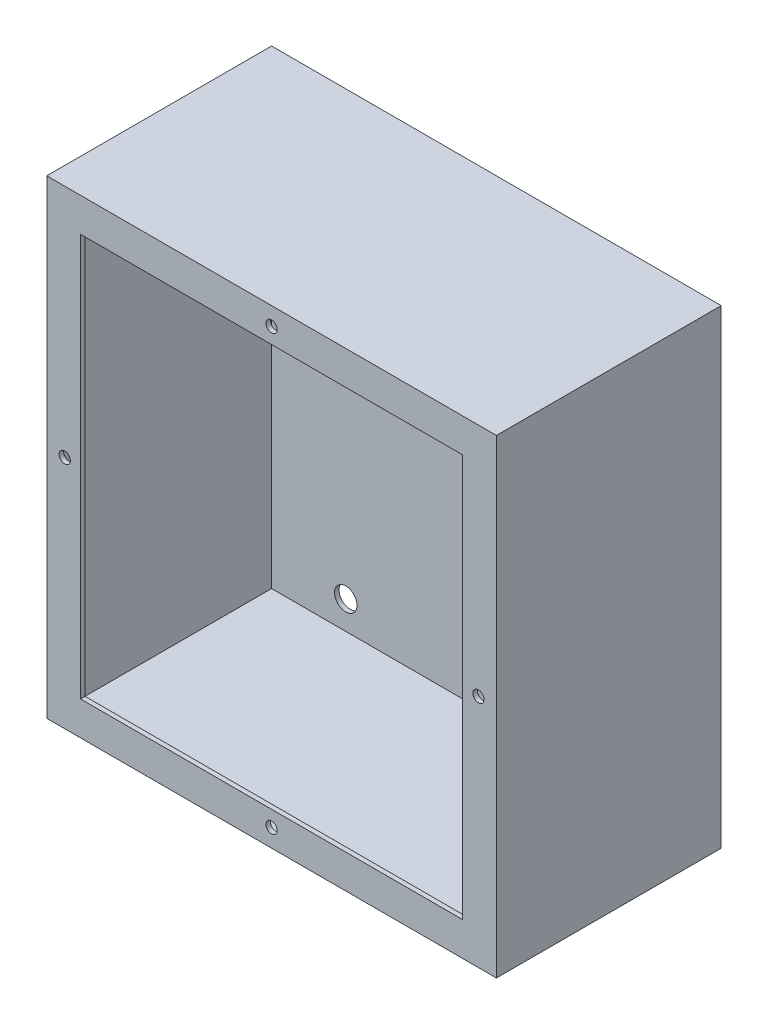
ISO-10303-21;
HEADER;
FILE_DESCRIPTION(('STEP AP214'),'2;1');
FILE_NAME('part.step','',(''),(''),'','','');
FILE_SCHEMA(('AUTOMOTIVE_DESIGN { 1 0 10303 214 1 1 1 1 }'));
ENDSEC;
DATA;
#1=APPLICATION_CONTEXT('core data for automotive mechanical design processes');
#2=APPLICATION_PROTOCOL_DEFINITION('international standard','automotive_design',2000,#1);
#3=PRODUCT_CONTEXT('',#1,'mechanical');
#4=PRODUCT('Part','Part','',(#3));
#5=PRODUCT_RELATED_PRODUCT_CATEGORY('part','',(#4));
#6=PRODUCT_DEFINITION_FORMATION('','',#4);
#7=PRODUCT_DEFINITION_CONTEXT('part definition',#1,'design');
#8=PRODUCT_DEFINITION('design','',#6,#7);
#9=PRODUCT_DEFINITION_SHAPE('','',#8);
#10=(LENGTH_UNIT() NAMED_UNIT(*) SI_UNIT(.MILLI.,.METRE.));
#11=(NAMED_UNIT(*) PLANE_ANGLE_UNIT() SI_UNIT($,.RADIAN.));
#12=(NAMED_UNIT(*) SI_UNIT($,.STERADIAN.) SOLID_ANGLE_UNIT());
#13=UNCERTAINTY_MEASURE_WITH_UNIT(LENGTH_MEASURE(1.E-05),#10,'distance_accuracy_value','');
#14=(GEOMETRIC_REPRESENTATION_CONTEXT(3) GLOBAL_UNCERTAINTY_ASSIGNED_CONTEXT((#13)) GLOBAL_UNIT_ASSIGNED_CONTEXT((#10,
#11,#12)) REPRESENTATION_CONTEXT('',''));
#15=CARTESIAN_POINT('',(0.,0.,0.));
#16=DIRECTION('',(0.,0.,1.));
#17=DIRECTION('',(1.,0.,0.));
#18=AXIS2_PLACEMENT_3D('',#15,#16,#17);
#19=CARTESIAN_POINT('',(0.,0.,100.));
#20=DIRECTION('',(1.,0.,0.));
#21=DIRECTION('',(0.,1.,0.));
#22=AXIS2_PLACEMENT_3D('',#19,#20,#21);
#23=PLANE('',#22);
#24=DIRECTION('',(0.,-1.,0.));
#25=VECTOR('',#24,1.);
#26=CARTESIAN_POINT('',(0.,0.,0.));
#27=LINE('',#26,#25);
#28=CARTESIAN_POINT('',(0.,0.,0.));
#29=VERTEX_POINT('',#28);
#30=CARTESIAN_POINT('',(0.,-209.,0.));
#31=VERTEX_POINT('',#30);
#32=EDGE_CURVE('E190',#29,#31,#27,.T.);
#33=ORIENTED_EDGE('',*,*,#32,.T.);
#34=DIRECTION('',(0.,0.,-1.));
#35=VECTOR('',#34,1.);
#36=CARTESIAN_POINT('',(0.,-209.,100.));
#37=LINE('',#36,#35);
#38=CARTESIAN_POINT('',(0.,-209.,100.));
#39=VERTEX_POINT('',#38);
#40=EDGE_CURVE('E11',#39,#31,#37,.T.);
#41=ORIENTED_EDGE('',*,*,#40,.F.);
#42=DIRECTION('',(0.,-1.,0.));
#43=VECTOR('',#42,1.);
#44=CARTESIAN_POINT('',(0.,0.,100.));
#45=LINE('',#44,#43);
#46=CARTESIAN_POINT('',(0.,0.,100.));
#47=VERTEX_POINT('',#46);
#48=EDGE_CURVE('E205',#47,#39,#45,.T.);
#49=ORIENTED_EDGE('',*,*,#48,.F.);
#50=DIRECTION('',(0.,0.,-1.));
#51=VECTOR('',#50,1.);
#52=CARTESIAN_POINT('',(0.,0.,100.));
#53=LINE('',#52,#51);
#54=EDGE_CURVE('E211',#47,#29,#53,.T.);
#55=ORIENTED_EDGE('',*,*,#54,.T.);
#56=EDGE_LOOP('',(#33,#41,#49,#55));
#57=FACE_BOUND('',#56,.T.);
#58=ADVANCED_FACE('F30',(#57),#23,.F.);
#59=CARTESIAN_POINT('',(0.,-209.,100.));
#60=DIRECTION('',(0.,1.,0.));
#61=DIRECTION('',(0.,0.,1.));
#62=AXIS2_PLACEMENT_3D('',#59,#60,#61);
#63=PLANE('',#62);
#64=DIRECTION('',(1.,0.,0.));
#65=VECTOR('',#64,1.);
#66=CARTESIAN_POINT('',(0.,-209.,0.));
#67=LINE('',#66,#65);
#68=CARTESIAN_POINT('',(200.,-209.,0.));
#69=VERTEX_POINT('',#68);
#70=EDGE_CURVE('E214',#31,#69,#67,.T.);
#71=ORIENTED_EDGE('',*,*,#70,.T.);
#72=DIRECTION('',(0.,0.,-1.));
#73=VECTOR('',#72,1.);
#74=CARTESIAN_POINT('',(200.,-209.,100.));
#75=LINE('',#74,#73);
#76=CARTESIAN_POINT('',(200.,-209.,100.));
#77=VERTEX_POINT('',#76);
#78=EDGE_CURVE('E38',#77,#69,#75,.T.);
#79=ORIENTED_EDGE('',*,*,#78,.F.);
#80=DIRECTION('',(1.,0.,0.));
#81=VECTOR('',#80,1.);
#82=CARTESIAN_POINT('',(0.,-209.,100.));
#83=LINE('',#82,#81);
#84=EDGE_CURVE('E83',#39,#77,#83,.T.);
#85=ORIENTED_EDGE('',*,*,#84,.F.);
#86=ORIENTED_EDGE('',*,*,#40,.T.);
#87=EDGE_LOOP('',(#71,#79,#85,#86));
#88=FACE_BOUND('',#87,.T.);
#89=ADVANCED_FACE('F289',(#88),#63,.F.);
#90=CARTESIAN_POINT('',(200.,0.,100.));
#91=DIRECTION('',(-1.,0.,0.));
#92=DIRECTION('',(0.,-1.,0.));
#93=AXIS2_PLACEMENT_3D('',#90,#91,#92);
#94=PLANE('',#93);
#95=DIRECTION('',(0.,1.,0.));
#96=VECTOR('',#95,1.);
#97=CARTESIAN_POINT('',(200.,0.,0.));
#98=LINE('',#97,#96);
#99=CARTESIAN_POINT('',(200.,0.,0.));
#100=VERTEX_POINT('',#99);
#101=EDGE_CURVE('E216',#69,#100,#98,.T.);
#102=ORIENTED_EDGE('',*,*,#101,.T.);
#103=DIRECTION('',(0.,0.,-1.));
#104=VECTOR('',#103,1.);
#105=CARTESIAN_POINT('',(200.,0.,100.));
#106=LINE('',#105,#104);
#107=CARTESIAN_POINT('',(200.,0.,100.));
#108=VERTEX_POINT('',#107);
#109=EDGE_CURVE('E220',#108,#100,#106,.T.);
#110=ORIENTED_EDGE('',*,*,#109,.F.);
#111=DIRECTION('',(0.,1.,0.));
#112=VECTOR('',#111,1.);
#113=CARTESIAN_POINT('',(200.,0.,100.));
#114=LINE('',#113,#112);
#115=EDGE_CURVE('E208',#77,#108,#114,.T.);
#116=ORIENTED_EDGE('',*,*,#115,.F.);
#117=ORIENTED_EDGE('',*,*,#78,.T.);
#118=EDGE_LOOP('',(#102,#110,#116,#117));
#119=FACE_BOUND('',#118,.T.);
#120=ADVANCED_FACE('F288',(#119),#94,.F.);
#121=CARTESIAN_POINT('',(0.,0.,100.));
#122=DIRECTION('',(0.,-1.,0.));
#123=DIRECTION('',(0.,0.,-1.));
#124=AXIS2_PLACEMENT_3D('',#121,#122,#123);
#125=PLANE('',#124);
#126=DIRECTION('',(-1.,0.,0.));
#127=VECTOR('',#126,1.);
#128=CARTESIAN_POINT('',(0.,0.,0.));
#129=LINE('',#128,#127);
#130=EDGE_CURVE('E76',#100,#29,#129,.T.);
#131=ORIENTED_EDGE('',*,*,#130,.T.);
#132=ORIENTED_EDGE('',*,*,#54,.F.);
#133=DIRECTION('',(-1.,0.,0.));
#134=VECTOR('',#133,1.);
#135=CARTESIAN_POINT('',(0.,0.,100.));
#136=LINE('',#135,#134);
#137=EDGE_CURVE('E55',#108,#47,#136,.T.);
#138=ORIENTED_EDGE('',*,*,#137,.F.);
#139=ORIENTED_EDGE('',*,*,#109,.T.);
#140=EDGE_LOOP('',(#131,#132,#138,#139));
#141=FACE_BOUND('',#140,.T.);
#142=ADVANCED_FACE('F284',(#141),#125,.F.);
#143=CARTESIAN_POINT('',(0.,-209.,100.));
#144=DIRECTION('',(0.,0.,1.));
#145=DIRECTION('',(1.,0.,0.));
#146=AXIS2_PLACEMENT_3D('',#143,#144,#145);
#147=PLANE('',#146);
#148=CARTESIAN_POINT('',(100.,-201.,100.));
#149=DIRECTION('',(0.,0.,1.));
#150=DIRECTION('',(1.,0.,0.));
#151=AXIS2_PLACEMENT_3D('',#148,#149,#150);
#152=CIRCLE('',#151,2.50000000000001);
#153=CARTESIAN_POINT('',(102.5,-201.,100.));
#154=VERTEX_POINT('',#153);
#155=EDGE_CURVE('E257',#154,#154,#152,.T.);
#156=ORIENTED_EDGE('',*,*,#155,.F.);
#157=EDGE_LOOP('',(#156));
#158=FACE_BOUND('',#157,.T.);
#159=CARTESIAN_POINT('',(8.,-104.5,100.));
#160=DIRECTION('',(0.,0.,1.));
#161=DIRECTION('',(1.,0.,0.));
#162=AXIS2_PLACEMENT_3D('',#159,#160,#161);
#163=CIRCLE('',#162,2.5);
#164=CARTESIAN_POINT('',(10.5,-104.5,100.));
#165=VERTEX_POINT('',#164);
#166=EDGE_CURVE('E247',#165,#165,#163,.T.);
#167=ORIENTED_EDGE('',*,*,#166,.F.);
#168=EDGE_LOOP('',(#167));
#169=FACE_BOUND('',#168,.T.);
#170=CARTESIAN_POINT('',(192.,-104.5,100.));
#171=DIRECTION('',(0.,0.,1.));
#172=DIRECTION('',(1.,0.,0.));
#173=AXIS2_PLACEMENT_3D('',#170,#171,#172);
#174=CIRCLE('',#173,2.5);
#175=CARTESIAN_POINT('',(194.5,-104.5,100.));
#176=VERTEX_POINT('',#175);
#177=EDGE_CURVE('E244',#176,#176,#174,.T.);
#178=ORIENTED_EDGE('',*,*,#177,.F.);
#179=EDGE_LOOP('',(#178));
#180=FACE_BOUND('',#179,.T.);
#181=CARTESIAN_POINT('',(100.,-8.,100.));
#182=DIRECTION('',(0.,0.,1.));
#183=DIRECTION('',(1.,0.,0.));
#184=AXIS2_PLACEMENT_3D('',#181,#182,#183);
#185=CIRCLE('',#184,2.5);
#186=CARTESIAN_POINT('',(102.5,-8.,100.));
#187=VERTEX_POINT('',#186);
#188=EDGE_CURVE('E241',#187,#187,#185,.T.);
#189=ORIENTED_EDGE('',*,*,#188,.F.);
#190=EDGE_LOOP('',(#189));
#191=FACE_BOUND('',#190,.T.);
#192=ORIENTED_EDGE('',*,*,#48,.T.);
#193=ORIENTED_EDGE('',*,*,#84,.T.);
#194=ORIENTED_EDGE('',*,*,#115,.T.);
#195=ORIENTED_EDGE('',*,*,#137,.T.);
#196=EDGE_LOOP('',(#192,#193,#194,#195));
#197=FACE_BOUND('',#196,.T.);
#198=DIRECTION('',(-1.,0.,0.));
#199=VECTOR('',#198,1.);
#200=CARTESIAN_POINT('',(185.,-15.,100.));
#201=LINE('',#200,#199);
#202=CARTESIAN_POINT('',(185.,-15.,100.));
#203=VERTEX_POINT('',#202);
#204=CARTESIAN_POINT('',(15.,-15.,100.));
#205=VERTEX_POINT('',#204);
#206=EDGE_CURVE('E136',#203,#205,#201,.T.);
#207=ORIENTED_EDGE('',*,*,#206,.F.);
#208=DIRECTION('',(0.,1.,0.));
#209=VECTOR('',#208,1.);
#210=CARTESIAN_POINT('',(185.,-194.,100.));
#211=LINE('',#210,#209);
#212=CARTESIAN_POINT('',(185.,-194.,100.));
#213=VERTEX_POINT('',#212);
#214=EDGE_CURVE('E153',#213,#203,#211,.T.);
#215=ORIENTED_EDGE('',*,*,#214,.F.);
#216=DIRECTION('',(1.,0.,0.));
#217=VECTOR('',#216,1.);
#218=CARTESIAN_POINT('',(15.,-194.,100.));
#219=LINE('',#218,#217);
#220=CARTESIAN_POINT('',(15.,-194.,100.));
#221=VERTEX_POINT('',#220);
#222=EDGE_CURVE('E156',#221,#213,#219,.T.);
#223=ORIENTED_EDGE('',*,*,#222,.F.);
#224=DIRECTION('',(0.,-1.,0.));
#225=VECTOR('',#224,1.);
#226=CARTESIAN_POINT('',(15.,-15.,100.));
#227=LINE('',#226,#225);
#228=EDGE_CURVE('E165',#205,#221,#227,.T.);
#229=ORIENTED_EDGE('',*,*,#228,.F.);
#230=EDGE_LOOP('',(#207,#215,#223,#229));
#231=FACE_BOUND('',#230,.T.);
#232=ADVANCED_FACE('F273',(#158,#169,#180,#191,#197,#231),#147,.T.);
#233=CARTESIAN_POINT('',(0.,-209.,0.));
#234=DIRECTION('',(0.,0.,1.));
#235=DIRECTION('',(1.,0.,0.));
#236=AXIS2_PLACEMENT_3D('',#233,#234,#235);
#237=PLANE('',#236);
#238=CARTESIAN_POINT('',(34.9999999999982,-194.500000000002,0.));
#239=DIRECTION('',(0.,0.,-1.));
#240=DIRECTION('',(-1.,0.,0.));
#241=AXIS2_PLACEMENT_3D('',#238,#239,#240);
#242=CIRCLE('',#241,5.);
#243=CARTESIAN_POINT('',(29.9999999999982,-194.500000000002,0.));
#244=VERTEX_POINT('',#243);
#245=EDGE_CURVE('E237',#244,#244,#242,.T.);
#246=ORIENTED_EDGE('',*,*,#245,.F.);
#247=EDGE_LOOP('',(#246));
#248=FACE_BOUND('',#247,.T.);
#249=CARTESIAN_POINT('',(164.999999999998,-194.500000000002,0.));
#250=DIRECTION('',(0.,0.,-1.));
#251=DIRECTION('',(-1.,0.,0.));
#252=AXIS2_PLACEMENT_3D('',#249,#250,#251);
#253=CIRCLE('',#252,5.00000000000002);
#254=CARTESIAN_POINT('',(159.999999999998,-194.500000000002,0.));
#255=VERTEX_POINT('',#254);
#256=EDGE_CURVE('E233',#255,#255,#253,.T.);
#257=ORIENTED_EDGE('',*,*,#256,.F.);
#258=EDGE_LOOP('',(#257));
#259=FACE_BOUND('',#258,.T.);
#260=CARTESIAN_POINT('',(35.0000000000001,-14.5000000000018,0.));
#261=DIRECTION('',(0.,0.,-1.));
#262=DIRECTION('',(-1.,0.,0.));
#263=AXIS2_PLACEMENT_3D('',#260,#261,#262);
#264=CIRCLE('',#263,5.);
#265=CARTESIAN_POINT('',(30.0000000000001,-14.5000000000018,0.));
#266=VERTEX_POINT('',#265);
#267=EDGE_CURVE('E229',#266,#266,#264,.T.);
#268=ORIENTED_EDGE('',*,*,#267,.F.);
#269=EDGE_LOOP('',(#268));
#270=FACE_BOUND('',#269,.T.);
#271=CARTESIAN_POINT('',(165.,-14.5000000000018,0.));
#272=DIRECTION('',(0.,0.,-1.));
#273=DIRECTION('',(-1.,0.,0.));
#274=AXIS2_PLACEMENT_3D('',#271,#272,#273);
#275=CIRCLE('',#274,4.99999999999999);
#276=CARTESIAN_POINT('',(160.,-14.5000000000018,0.));
#277=VERTEX_POINT('',#276);
#278=EDGE_CURVE('E159',#277,#277,#275,.T.);
#279=ORIENTED_EDGE('',*,*,#278,.F.);
#280=EDGE_LOOP('',(#279));
#281=FACE_BOUND('',#280,.T.);
#282=ORIENTED_EDGE('',*,*,#32,.F.);
#283=ORIENTED_EDGE('',*,*,#130,.F.);
#284=ORIENTED_EDGE('',*,*,#101,.F.);
#285=ORIENTED_EDGE('',*,*,#70,.F.);
#286=EDGE_LOOP('',(#282,#283,#284,#285));
#287=FACE_BOUND('',#286,.T.);
#288=ADVANCED_FACE('F270',(#248,#259,#270,#281,#287),#237,.F.);
#289=CARTESIAN_POINT('',(2.,-207.,98.));
#290=DIRECTION('',(0.,0.,1.));
#291=DIRECTION('',(1.,0.,0.));
#292=AXIS2_PLACEMENT_3D('',#289,#290,#291);
#293=PLANE('',#292);
#294=CARTESIAN_POINT('',(100.,-201.,98.));
#295=DIRECTION('',(0.,0.,1.));
#296=DIRECTION('',(1.,0.,0.));
#297=AXIS2_PLACEMENT_3D('',#294,#295,#296);
#298=CIRCLE('',#297,2.50000000000001);
#299=CARTESIAN_POINT('',(102.5,-201.,98.));
#300=VERTEX_POINT('',#299);
#301=EDGE_CURVE('E33',#300,#300,#298,.T.);
#302=ORIENTED_EDGE('',*,*,#301,.T.);
#303=EDGE_LOOP('',(#302));
#304=FACE_BOUND('',#303,.T.);
#305=CARTESIAN_POINT('',(8.,-104.5,98.));
#306=DIRECTION('',(0.,0.,1.));
#307=DIRECTION('',(1.,0.,0.));
#308=AXIS2_PLACEMENT_3D('',#305,#306,#307);
#309=CIRCLE('',#308,2.5);
#310=CARTESIAN_POINT('',(10.5,-104.5,98.));
#311=VERTEX_POINT('',#310);
#312=EDGE_CURVE('E245',#311,#311,#309,.T.);
#313=ORIENTED_EDGE('',*,*,#312,.T.);
#314=EDGE_LOOP('',(#313));
#315=FACE_BOUND('',#314,.T.);
#316=CARTESIAN_POINT('',(192.,-104.5,98.));
#317=DIRECTION('',(0.,0.,1.));
#318=DIRECTION('',(1.,0.,0.));
#319=AXIS2_PLACEMENT_3D('',#316,#317,#318);
#320=CIRCLE('',#319,2.5);
#321=CARTESIAN_POINT('',(194.5,-104.5,98.));
#322=VERTEX_POINT('',#321);
#323=EDGE_CURVE('E242',#322,#322,#320,.T.);
#324=ORIENTED_EDGE('',*,*,#323,.T.);
#325=EDGE_LOOP('',(#324));
#326=FACE_BOUND('',#325,.T.);
#327=CARTESIAN_POINT('',(100.,-8.,98.));
#328=DIRECTION('',(0.,0.,1.));
#329=DIRECTION('',(1.,0.,0.));
#330=AXIS2_PLACEMENT_3D('',#327,#328,#329);
#331=CIRCLE('',#330,2.5);
#332=CARTESIAN_POINT('',(102.5,-8.,98.));
#333=VERTEX_POINT('',#332);
#334=EDGE_CURVE('E238',#333,#333,#331,.T.);
#335=ORIENTED_EDGE('',*,*,#334,.T.);
#336=EDGE_LOOP('',(#335));
#337=FACE_BOUND('',#336,.T.);
#338=DIRECTION('',(0.,1.,0.));
#339=VECTOR('',#338,1.);
#340=CARTESIAN_POINT('',(185.,-194.,98.));
#341=LINE('',#340,#339);
#342=CARTESIAN_POINT('',(185.,-194.,98.));
#343=VERTEX_POINT('',#342);
#344=CARTESIAN_POINT('',(185.,-15.,98.));
#345=VERTEX_POINT('',#344);
#346=EDGE_CURVE('E141',#343,#345,#341,.T.);
#347=ORIENTED_EDGE('',*,*,#346,.T.);
#348=DIRECTION('',(-1.,0.,0.));
#349=VECTOR('',#348,1.);
#350=CARTESIAN_POINT('',(185.,-15.,98.));
#351=LINE('',#350,#349);
#352=CARTESIAN_POINT('',(15.,-15.,98.));
#353=VERTEX_POINT('',#352);
#354=EDGE_CURVE('E133',#345,#353,#351,.T.);
#355=ORIENTED_EDGE('',*,*,#354,.T.);
#356=DIRECTION('',(0.,-1.,0.));
#357=VECTOR('',#356,1.);
#358=CARTESIAN_POINT('',(15.,-15.,98.));
#359=LINE('',#358,#357);
#360=CARTESIAN_POINT('',(15.,-194.,98.));
#361=VERTEX_POINT('',#360);
#362=EDGE_CURVE('E145',#353,#361,#359,.T.);
#363=ORIENTED_EDGE('',*,*,#362,.T.);
#364=DIRECTION('',(1.,0.,0.));
#365=VECTOR('',#364,1.);
#366=CARTESIAN_POINT('',(15.,-194.,98.));
#367=LINE('',#366,#365);
#368=EDGE_CURVE('E149',#361,#343,#367,.T.);
#369=ORIENTED_EDGE('',*,*,#368,.T.);
#370=EDGE_LOOP('',(#347,#355,#363,#369));
#371=FACE_BOUND('',#370,.T.);
#372=DIRECTION('',(0.,-1.,0.));
#373=VECTOR('',#372,1.);
#374=CARTESIAN_POINT('',(2.,-2.,98.));
#375=LINE('',#374,#373);
#376=CARTESIAN_POINT('',(2.,-2.,98.));
#377=VERTEX_POINT('',#376);
#378=CARTESIAN_POINT('',(2.,-207.,98.));
#379=VERTEX_POINT('',#378);
#380=EDGE_CURVE('E46',#377,#379,#375,.T.);
#381=ORIENTED_EDGE('',*,*,#380,.F.);
#382=DIRECTION('',(-1.,0.,0.));
#383=VECTOR('',#382,1.);
#384=CARTESIAN_POINT('',(2.,-2.,98.));
#385=LINE('',#384,#383);
#386=CARTESIAN_POINT('',(198.,-2.,98.));
#387=VERTEX_POINT('',#386);
#388=EDGE_CURVE('E182',#387,#377,#385,.T.);
#389=ORIENTED_EDGE('',*,*,#388,.F.);
#390=DIRECTION('',(0.,1.,0.));
#391=VECTOR('',#390,1.);
#392=CARTESIAN_POINT('',(198.,-2.,98.));
#393=LINE('',#392,#391);
#394=CARTESIAN_POINT('',(198.,-207.,98.));
#395=VERTEX_POINT('',#394);
#396=EDGE_CURVE('E179',#395,#387,#393,.T.);
#397=ORIENTED_EDGE('',*,*,#396,.F.);
#398=DIRECTION('',(1.,0.,0.));
#399=VECTOR('',#398,1.);
#400=CARTESIAN_POINT('',(2.,-207.,98.));
#401=LINE('',#400,#399);
#402=EDGE_CURVE('E176',#379,#395,#401,.T.);
#403=ORIENTED_EDGE('',*,*,#402,.F.);
#404=EDGE_LOOP('',(#381,#389,#397,#403));
#405=FACE_BOUND('',#404,.T.);
#406=ADVANCED_FACE('F151',(#304,#315,#326,#337,#371,#405),#293,.F.);
#407=CARTESIAN_POINT('',(185.,-15.,98.));
#408=DIRECTION('',(0.,1.,0.));
#409=DIRECTION('',(0.,0.,1.));
#410=AXIS2_PLACEMENT_3D('',#407,#408,#409);
#411=PLANE('',#410);
#412=ORIENTED_EDGE('',*,*,#206,.T.);
#413=DIRECTION('',(0.,0.,1.));
#414=VECTOR('',#413,1.);
#415=CARTESIAN_POINT('',(15.,-15.,98.));
#416=LINE('',#415,#414);
#417=EDGE_CURVE('E129',#353,#205,#416,.T.);
#418=ORIENTED_EDGE('',*,*,#417,.F.);
#419=ORIENTED_EDGE('',*,*,#354,.F.);
#420=DIRECTION('',(0.,0.,1.));
#421=VECTOR('',#420,1.);
#422=CARTESIAN_POINT('',(185.,-15.,98.));
#423=LINE('',#422,#421);
#424=EDGE_CURVE('E170',#345,#203,#423,.T.);
#425=ORIENTED_EDGE('',*,*,#424,.T.);
#426=EDGE_LOOP('',(#412,#418,#419,#425));
#427=FACE_BOUND('',#426,.T.);
#428=ADVANCED_FACE('F131',(#427),#411,.F.);
#429=CARTESIAN_POINT('',(185.,-194.,98.));
#430=DIRECTION('',(1.,0.,0.));
#431=DIRECTION('',(0.,1.,0.));
#432=AXIS2_PLACEMENT_3D('',#429,#430,#431);
#433=PLANE('',#432);
#434=ORIENTED_EDGE('',*,*,#214,.T.);
#435=ORIENTED_EDGE('',*,*,#424,.F.);
#436=ORIENTED_EDGE('',*,*,#346,.F.);
#437=DIRECTION('',(0.,0.,1.));
#438=VECTOR('',#437,1.);
#439=CARTESIAN_POINT('',(185.,-194.,98.));
#440=LINE('',#439,#438);
#441=EDGE_CURVE('E172',#343,#213,#440,.T.);
#442=ORIENTED_EDGE('',*,*,#441,.T.);
#443=EDGE_LOOP('',(#434,#435,#436,#442));
#444=FACE_BOUND('',#443,.T.);
#445=ADVANCED_FACE('F328',(#444),#433,.F.);
#446=CARTESIAN_POINT('',(15.,-194.,98.));
#447=DIRECTION('',(0.,-1.,0.));
#448=DIRECTION('',(0.,0.,-1.));
#449=AXIS2_PLACEMENT_3D('',#446,#447,#448);
#450=PLANE('',#449);
#451=ORIENTED_EDGE('',*,*,#222,.T.);
#452=ORIENTED_EDGE('',*,*,#441,.F.);
#453=ORIENTED_EDGE('',*,*,#368,.F.);
#454=DIRECTION('',(0.,0.,1.));
#455=VECTOR('',#454,1.);
#456=CARTESIAN_POINT('',(15.,-194.,98.));
#457=LINE('',#456,#455);
#458=EDGE_CURVE('E140',#361,#221,#457,.T.);
#459=ORIENTED_EDGE('',*,*,#458,.T.);
#460=EDGE_LOOP('',(#451,#452,#453,#459));
#461=FACE_BOUND('',#460,.T.);
#462=ADVANCED_FACE('F331',(#461),#450,.F.);
#463=CARTESIAN_POINT('',(15.,-15.,98.));
#464=DIRECTION('',(-1.,0.,0.));
#465=DIRECTION('',(0.,-1.,0.));
#466=AXIS2_PLACEMENT_3D('',#463,#464,#465);
#467=PLANE('',#466);
#468=ORIENTED_EDGE('',*,*,#228,.T.);
#469=ORIENTED_EDGE('',*,*,#458,.F.);
#470=ORIENTED_EDGE('',*,*,#362,.F.);
#471=ORIENTED_EDGE('',*,*,#417,.T.);
#472=EDGE_LOOP('',(#468,#469,#470,#471));
#473=FACE_BOUND('',#472,.T.);
#474=ADVANCED_FACE('F146',(#473),#467,.F.);
#475=CARTESIAN_POINT('',(0.,-209.,2.));
#476=DIRECTION('',(0.,0.,1.));
#477=DIRECTION('',(1.,0.,0.));
#478=AXIS2_PLACEMENT_3D('',#475,#476,#477);
#479=PLANE('',#478);
#480=CARTESIAN_POINT('',(34.9999999999982,-194.500000000002,2.));
#481=DIRECTION('',(0.,0.,1.));
#482=DIRECTION('',(1.,0.,0.));
#483=AXIS2_PLACEMENT_3D('',#480,#481,#482);
#484=CIRCLE('',#483,5.);
#485=CARTESIAN_POINT('',(39.9999999999982,-194.500000000002,2.));
#486=VERTEX_POINT('',#485);
#487=EDGE_CURVE('E234',#486,#486,#484,.T.);
#488=ORIENTED_EDGE('',*,*,#487,.F.);
#489=EDGE_LOOP('',(#488));
#490=FACE_BOUND('',#489,.T.);
#491=CARTESIAN_POINT('',(164.999999999998,-194.500000000002,2.));
#492=DIRECTION('',(0.,0.,1.));
#493=DIRECTION('',(1.,0.,0.));
#494=AXIS2_PLACEMENT_3D('',#491,#492,#493);
#495=CIRCLE('',#494,5.00000000000002);
#496=CARTESIAN_POINT('',(169.999999999998,-194.500000000002,2.));
#497=VERTEX_POINT('',#496);
#498=EDGE_CURVE('E230',#497,#497,#495,.T.);
#499=ORIENTED_EDGE('',*,*,#498,.F.);
#500=EDGE_LOOP('',(#499));
#501=FACE_BOUND('',#500,.T.);
#502=CARTESIAN_POINT('',(35.0000000000001,-14.5000000000018,2.));
#503=DIRECTION('',(0.,0.,1.));
#504=DIRECTION('',(1.,0.,0.));
#505=AXIS2_PLACEMENT_3D('',#502,#503,#504);
#506=CIRCLE('',#505,5.);
#507=CARTESIAN_POINT('',(40.0000000000001,-14.5000000000018,2.));
#508=VERTEX_POINT('',#507);
#509=EDGE_CURVE('E226',#508,#508,#506,.T.);
#510=ORIENTED_EDGE('',*,*,#509,.F.);
#511=EDGE_LOOP('',(#510));
#512=FACE_BOUND('',#511,.T.);
#513=CARTESIAN_POINT('',(165.,-14.5000000000018,2.));
#514=DIRECTION('',(0.,0.,1.));
#515=DIRECTION('',(1.,0.,0.));
#516=AXIS2_PLACEMENT_3D('',#513,#514,#515);
#517=CIRCLE('',#516,4.99999999999999);
#518=CARTESIAN_POINT('',(170.,-14.5000000000018,2.));
#519=VERTEX_POINT('',#518);
#520=EDGE_CURVE('E166',#519,#519,#517,.T.);
#521=ORIENTED_EDGE('',*,*,#520,.F.);
#522=EDGE_LOOP('',(#521));
#523=FACE_BOUND('',#522,.T.);
#524=DIRECTION('',(0.,-1.,0.));
#525=VECTOR('',#524,1.);
#526=CARTESIAN_POINT('',(2.,0.,2.));
#527=LINE('',#526,#525);
#528=CARTESIAN_POINT('',(2.,-2.,2.));
#529=VERTEX_POINT('',#528);
#530=CARTESIAN_POINT('',(2.00000000000003,-207.,2.));
#531=VERTEX_POINT('',#530);
#532=EDGE_CURVE('E184',#529,#531,#527,.T.);
#533=ORIENTED_EDGE('',*,*,#532,.T.);
#534=DIRECTION('',(1.,0.,0.));
#535=VECTOR('',#534,1.);
#536=CARTESIAN_POINT('',(0.,-207.,2.));
#537=LINE('',#536,#535);
#538=CARTESIAN_POINT('',(198.,-207.,2.));
#539=VERTEX_POINT('',#538);
#540=EDGE_CURVE('E187',#531,#539,#537,.T.);
#541=ORIENTED_EDGE('',*,*,#540,.T.);
#542=DIRECTION('',(0.,1.,0.));
#543=VECTOR('',#542,1.);
#544=CARTESIAN_POINT('',(198.,0.,2.));
#545=LINE('',#544,#543);
#546=CARTESIAN_POINT('',(198.,-2.,2.));
#547=VERTEX_POINT('',#546);
#548=EDGE_CURVE('E198',#539,#547,#545,.T.);
#549=ORIENTED_EDGE('',*,*,#548,.T.);
#550=DIRECTION('',(-1.,0.,0.));
#551=VECTOR('',#550,1.);
#552=CARTESIAN_POINT('',(0.,-2.,2.));
#553=LINE('',#552,#551);
#554=EDGE_CURVE('E195',#547,#529,#553,.T.);
#555=ORIENTED_EDGE('',*,*,#554,.T.);
#556=EDGE_LOOP('',(#533,#541,#549,#555));
#557=FACE_BOUND('',#556,.T.);
#558=ADVANCED_FACE('F302',(#490,#501,#512,#523,#557),#479,.T.);
#559=CARTESIAN_POINT('',(0.,-2.,100.));
#560=DIRECTION('',(0.,-1.,0.));
#561=DIRECTION('',(0.,0.,-1.));
#562=AXIS2_PLACEMENT_3D('',#559,#560,#561);
#563=PLANE('',#562);
#564=DIRECTION('',(0.,0.,-1.));
#565=VECTOR('',#564,1.);
#566=CARTESIAN_POINT('',(198.,-2.,100.));
#567=LINE('',#566,#565);
#568=EDGE_CURVE('E194',#387,#547,#567,.T.);
#569=ORIENTED_EDGE('',*,*,#568,.F.);
#570=ORIENTED_EDGE('',*,*,#388,.T.);
#571=DIRECTION('',(0.,0.,-1.));
#572=VECTOR('',#571,1.);
#573=CARTESIAN_POINT('',(2.,-2.,100.));
#574=LINE('',#573,#572);
#575=EDGE_CURVE('E192',#377,#529,#574,.T.);
#576=ORIENTED_EDGE('',*,*,#575,.T.);
#577=ORIENTED_EDGE('',*,*,#554,.F.);
#578=EDGE_LOOP('',(#569,#570,#576,#577));
#579=FACE_BOUND('',#578,.T.);
#580=ADVANCED_FACE('F305',(#579),#563,.T.);
#581=CARTESIAN_POINT('',(198.,0.,100.));
#582=DIRECTION('',(-1.,0.,0.));
#583=DIRECTION('',(0.,-1.,0.));
#584=AXIS2_PLACEMENT_3D('',#581,#582,#583);
#585=PLANE('',#584);
#586=DIRECTION('',(0.,0.,-1.));
#587=VECTOR('',#586,1.);
#588=CARTESIAN_POINT('',(198.,-207.,100.));
#589=LINE('',#588,#587);
#590=EDGE_CURVE('E191',#395,#539,#589,.T.);
#591=ORIENTED_EDGE('',*,*,#590,.F.);
#592=ORIENTED_EDGE('',*,*,#396,.T.);
#593=ORIENTED_EDGE('',*,*,#568,.T.);
#594=ORIENTED_EDGE('',*,*,#548,.F.);
#595=EDGE_LOOP('',(#591,#592,#593,#594));
#596=FACE_BOUND('',#595,.T.);
#597=ADVANCED_FACE('F309',(#596),#585,.T.);
#598=CARTESIAN_POINT('',(0.,-207.,100.));
#599=DIRECTION('',(0.,1.,0.));
#600=DIRECTION('',(0.,0.,1.));
#601=AXIS2_PLACEMENT_3D('',#598,#599,#600);
#602=PLANE('',#601);
#603=DIRECTION('',(0.,0.,-1.));
#604=VECTOR('',#603,1.);
#605=CARTESIAN_POINT('',(2.00000000000003,-207.,100.));
#606=LINE('',#605,#604);
#607=EDGE_CURVE('E188',#379,#531,#606,.T.);
#608=ORIENTED_EDGE('',*,*,#607,.F.);
#609=ORIENTED_EDGE('',*,*,#402,.T.);
#610=ORIENTED_EDGE('',*,*,#590,.T.);
#611=ORIENTED_EDGE('',*,*,#540,.F.);
#612=EDGE_LOOP('',(#608,#609,#610,#611));
#613=FACE_BOUND('',#612,.T.);
#614=ADVANCED_FACE('F313',(#613),#602,.T.);
#615=CARTESIAN_POINT('',(2.,0.,100.));
#616=DIRECTION('',(1.,0.,0.));
#617=DIRECTION('',(0.,1.,0.));
#618=AXIS2_PLACEMENT_3D('',#615,#616,#617);
#619=PLANE('',#618);
#620=ORIENTED_EDGE('',*,*,#575,.F.);
#621=ORIENTED_EDGE('',*,*,#380,.T.);
#622=ORIENTED_EDGE('',*,*,#607,.T.);
#623=ORIENTED_EDGE('',*,*,#532,.F.);
#624=EDGE_LOOP('',(#620,#621,#622,#623));
#625=FACE_BOUND('',#624,.T.);
#626=ADVANCED_FACE('F317',(#625),#619,.T.);
#627=CARTESIAN_POINT('',(165.,-14.5000000000018,22.));
#628=DIRECTION('',(0.,0.,-1.));
#629=DIRECTION('',(-1.,0.,0.));
#630=AXIS2_PLACEMENT_3D('',#627,#628,#629);
#631=CYLINDRICAL_SURFACE('',#630,4.99999999999999);
#632=ORIENTED_EDGE('',*,*,#520,.T.);
#633=EDGE_LOOP('',(#632));
#634=FACE_BOUND('',#633,.T.);
#635=ORIENTED_EDGE('',*,*,#278,.T.);
#636=EDGE_LOOP('',(#635));
#637=FACE_BOUND('',#636,.T.);
#638=ADVANCED_FACE('F321',(#634,#637),#631,.F.);
#639=CARTESIAN_POINT('',(35.0000000000001,-14.5000000000018,22.));
#640=DIRECTION('',(0.,0.,-1.));
#641=DIRECTION('',(-1.,0.,0.));
#642=AXIS2_PLACEMENT_3D('',#639,#640,#641);
#643=CYLINDRICAL_SURFACE('',#642,5.);
#644=ORIENTED_EDGE('',*,*,#509,.T.);
#645=EDGE_LOOP('',(#644));
#646=FACE_BOUND('',#645,.T.);
#647=ORIENTED_EDGE('',*,*,#267,.T.);
#648=EDGE_LOOP('',(#647));
#649=FACE_BOUND('',#648,.T.);
#650=ADVANCED_FACE('F268',(#646,#649),#643,.F.);
#651=CARTESIAN_POINT('',(164.999999999998,-194.500000000002,22.));
#652=DIRECTION('',(0.,0.,-1.));
#653=DIRECTION('',(-1.,0.,0.));
#654=AXIS2_PLACEMENT_3D('',#651,#652,#653);
#655=CYLINDRICAL_SURFACE('',#654,5.00000000000002);
#656=ORIENTED_EDGE('',*,*,#498,.T.);
#657=EDGE_LOOP('',(#656));
#658=FACE_BOUND('',#657,.T.);
#659=ORIENTED_EDGE('',*,*,#256,.T.);
#660=EDGE_LOOP('',(#659));
#661=FACE_BOUND('',#660,.T.);
#662=ADVANCED_FACE('F343',(#658,#661),#655,.F.);
#663=CARTESIAN_POINT('',(34.9999999999982,-194.500000000002,22.));
#664=DIRECTION('',(0.,0.,-1.));
#665=DIRECTION('',(-1.,0.,0.));
#666=AXIS2_PLACEMENT_3D('',#663,#664,#665);
#667=CYLINDRICAL_SURFACE('',#666,5.);
#668=ORIENTED_EDGE('',*,*,#487,.T.);
#669=EDGE_LOOP('',(#668));
#670=FACE_BOUND('',#669,.T.);
#671=ORIENTED_EDGE('',*,*,#245,.T.);
#672=EDGE_LOOP('',(#671));
#673=FACE_BOUND('',#672,.T.);
#674=ADVANCED_FACE('F347',(#670,#673),#667,.F.);
#675=CARTESIAN_POINT('',(100.,-8.,90.));
#676=DIRECTION('',(0.,0.,1.));
#677=DIRECTION('',(1.,0.,0.));
#678=AXIS2_PLACEMENT_3D('',#675,#676,#677);
#679=CYLINDRICAL_SURFACE('',#678,2.5);
#680=ORIENTED_EDGE('',*,*,#188,.T.);
#681=EDGE_LOOP('',(#680));
#682=FACE_BOUND('',#681,.T.);
#683=ORIENTED_EDGE('',*,*,#334,.F.);
#684=EDGE_LOOP('',(#683));
#685=FACE_BOUND('',#684,.T.);
#686=ADVANCED_FACE('F351',(#682,#685),#679,.F.);
#687=CARTESIAN_POINT('',(192.,-104.5,90.));
#688=DIRECTION('',(0.,0.,1.));
#689=DIRECTION('',(1.,0.,0.));
#690=AXIS2_PLACEMENT_3D('',#687,#688,#689);
#691=CYLINDRICAL_SURFACE('',#690,2.5);
#692=ORIENTED_EDGE('',*,*,#177,.T.);
#693=EDGE_LOOP('',(#692));
#694=FACE_BOUND('',#693,.T.);
#695=ORIENTED_EDGE('',*,*,#323,.F.);
#696=EDGE_LOOP('',(#695));
#697=FACE_BOUND('',#696,.T.);
#698=ADVANCED_FACE('F355',(#694,#697),#691,.F.);
#699=CARTESIAN_POINT('',(8.,-104.5,90.));
#700=DIRECTION('',(0.,0.,1.));
#701=DIRECTION('',(1.,0.,0.));
#702=AXIS2_PLACEMENT_3D('',#699,#700,#701);
#703=CYLINDRICAL_SURFACE('',#702,2.5);
#704=ORIENTED_EDGE('',*,*,#166,.T.);
#705=EDGE_LOOP('',(#704));
#706=FACE_BOUND('',#705,.T.);
#707=ORIENTED_EDGE('',*,*,#312,.F.);
#708=EDGE_LOOP('',(#707));
#709=FACE_BOUND('',#708,.T.);
#710=ADVANCED_FACE('F359',(#706,#709),#703,.F.);
#711=CARTESIAN_POINT('',(100.,-201.,90.));
#712=DIRECTION('',(0.,0.,1.));
#713=DIRECTION('',(1.,0.,0.));
#714=AXIS2_PLACEMENT_3D('',#711,#712,#713);
#715=CYLINDRICAL_SURFACE('',#714,2.50000000000001);
#716=ORIENTED_EDGE('',*,*,#155,.T.);
#717=EDGE_LOOP('',(#716));
#718=FACE_BOUND('',#717,.T.);
#719=ORIENTED_EDGE('',*,*,#301,.F.);
#720=EDGE_LOOP('',(#719));
#721=FACE_BOUND('',#720,.T.);
#722=ADVANCED_FACE('F363',(#718,#721),#715,.F.);
#723=CLOSED_SHELL('',(#58,#89,#120,#142,#232,#288,#406,#428,#445,#462,#474,#558,#580,#597,#614,
#626,#638,#650,#662,#674,#686,#698,#710,#722));
#724=MANIFOLD_SOLID_BREP('B2',#723);
#725=ADVANCED_BREP_SHAPE_REPRESENTATION('',(#18,#724),#14);
#726=SHAPE_DEFINITION_REPRESENTATION(#9,#725);
ENDSEC;
END-ISO-10303-21;
